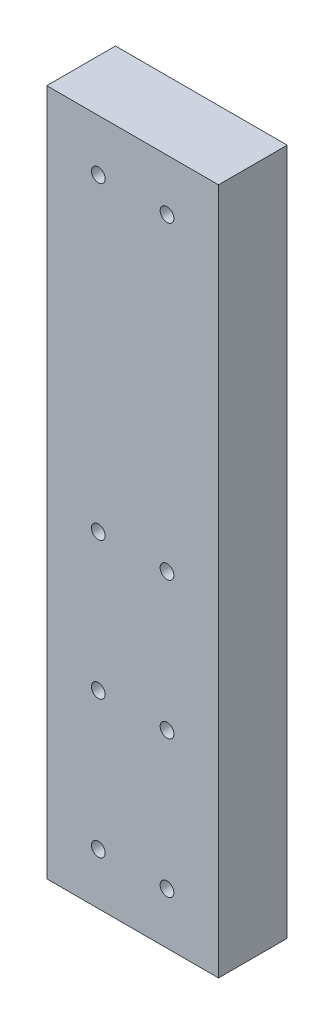
ISO-10303-21;
HEADER;
FILE_DESCRIPTION(('STEP AP214'),'2;1');
FILE_NAME('part.step','',(''),(''),'','','');
FILE_SCHEMA(('AUTOMOTIVE_DESIGN { 1 0 10303 214 1 1 1 1 }'));
ENDSEC;
DATA;
#1=APPLICATION_CONTEXT('core data for automotive mechanical design processes');
#2=APPLICATION_PROTOCOL_DEFINITION('international standard','automotive_design',2000,#1);
#3=PRODUCT_CONTEXT('',#1,'mechanical');
#4=PRODUCT('Part','Part','',(#3));
#5=PRODUCT_RELATED_PRODUCT_CATEGORY('part','',(#4));
#6=PRODUCT_DEFINITION_FORMATION('','',#4);
#7=PRODUCT_DEFINITION_CONTEXT('part definition',#1,'design');
#8=PRODUCT_DEFINITION('design','',#6,#7);
#9=PRODUCT_DEFINITION_SHAPE('','',#8);
#10=(LENGTH_UNIT() NAMED_UNIT(*) SI_UNIT(.MILLI.,.METRE.));
#11=(NAMED_UNIT(*) PLANE_ANGLE_UNIT() SI_UNIT($,.RADIAN.));
#12=(NAMED_UNIT(*) SI_UNIT($,.STERADIAN.) SOLID_ANGLE_UNIT());
#13=UNCERTAINTY_MEASURE_WITH_UNIT(LENGTH_MEASURE(1.E-05),#10,'distance_accuracy_value','');
#14=(GEOMETRIC_REPRESENTATION_CONTEXT(3) GLOBAL_UNCERTAINTY_ASSIGNED_CONTEXT((#13)) GLOBAL_UNIT_ASSIGNED_CONTEXT((#10,
#11,#12)) REPRESENTATION_CONTEXT('',''));
#15=CARTESIAN_POINT('',(0.,0.,0.));
#16=DIRECTION('',(0.,0.,1.));
#17=DIRECTION('',(1.,0.,0.));
#18=AXIS2_PLACEMENT_3D('',#15,#16,#17);
#19=CARTESIAN_POINT('',(0.,0.,10.));
#20=DIRECTION('',(0.,0.,-1.));
#21=DIRECTION('',(-1.,0.,0.));
#22=AXIS2_PLACEMENT_3D('',#19,#20,#21);
#23=PLANE('',#22);
#24=CARTESIAN_POINT('',(7.49999999999999,47.5,10.));
#25=DIRECTION('',(0.,0.,1.));
#26=DIRECTION('',(1.,0.,0.));
#27=AXIS2_PLACEMENT_3D('',#24,#25,#26);
#28=CIRCLE('',#27,1.);
#29=CARTESIAN_POINT('',(8.5,47.5,10.));
#30=VERTEX_POINT('',#29);
#31=EDGE_CURVE('E139',#30,#30,#28,.T.);
#32=ORIENTED_EDGE('',*,*,#31,.F.);
#33=EDGE_LOOP('',(#32));
#34=FACE_BOUND('',#33,.T.);
#35=CARTESIAN_POINT('',(7.5,27.5,10.));
#36=DIRECTION('',(0.,0.,1.));
#37=DIRECTION('',(1.,0.,0.));
#38=AXIS2_PLACEMENT_3D('',#35,#36,#37);
#39=CIRCLE('',#38,1.);
#40=CARTESIAN_POINT('',(8.5,27.5,10.));
#41=VERTEX_POINT('',#40);
#42=EDGE_CURVE('E126',#41,#41,#39,.T.);
#43=ORIENTED_EDGE('',*,*,#42,.F.);
#44=EDGE_LOOP('',(#43));
#45=FACE_BOUND('',#44,.T.);
#46=CARTESIAN_POINT('',(7.5,7.5,10.));
#47=DIRECTION('',(0.,0.,1.));
#48=DIRECTION('',(1.,0.,0.));
#49=AXIS2_PLACEMENT_3D('',#46,#47,#48);
#50=CIRCLE('',#49,1.);
#51=CARTESIAN_POINT('',(8.5,7.5,10.));
#52=VERTEX_POINT('',#51);
#53=EDGE_CURVE('E156',#52,#52,#50,.T.);
#54=ORIENTED_EDGE('',*,*,#53,.F.);
#55=EDGE_LOOP('',(#54));
#56=FACE_BOUND('',#55,.T.);
#57=CARTESIAN_POINT('',(7.49999999999999,92.5,10.));
#58=DIRECTION('',(0.,0.,1.));
#59=DIRECTION('',(1.,0.,0.));
#60=AXIS2_PLACEMENT_3D('',#57,#58,#59);
#61=CIRCLE('',#60,1.);
#62=CARTESIAN_POINT('',(8.49999999999999,92.5,10.));
#63=VERTEX_POINT('',#62);
#64=EDGE_CURVE('E117',#63,#63,#61,.T.);
#65=ORIENTED_EDGE('',*,*,#64,.F.);
#66=EDGE_LOOP('',(#65));
#67=FACE_BOUND('',#66,.T.);
#68=DIRECTION('',(0.,-1.,0.));
#69=VECTOR('',#68,1.);
#70=CARTESIAN_POINT('',(0.,0.,10.));
#71=LINE('',#70,#69);
#72=CARTESIAN_POINT('',(0.,100.,10.));
#73=VERTEX_POINT('',#72);
#74=CARTESIAN_POINT('',(0.,0.,10.));
#75=VERTEX_POINT('',#74);
#76=EDGE_CURVE('E90',#73,#75,#71,.T.);
#77=ORIENTED_EDGE('',*,*,#76,.T.);
#78=DIRECTION('',(1.,0.,0.));
#79=VECTOR('',#78,1.);
#80=CARTESIAN_POINT('',(0.,0.,10.));
#81=LINE('',#80,#79);
#82=CARTESIAN_POINT('',(25.,0.,10.));
#83=VERTEX_POINT('',#82);
#84=EDGE_CURVE('E85',#75,#83,#81,.T.);
#85=ORIENTED_EDGE('',*,*,#84,.T.);
#86=DIRECTION('',(0.,1.,0.));
#87=VECTOR('',#86,1.);
#88=CARTESIAN_POINT('',(25.,0.,10.));
#89=LINE('',#88,#87);
#90=CARTESIAN_POINT('',(25.,100.,10.));
#91=VERTEX_POINT('',#90);
#92=EDGE_CURVE('E88',#83,#91,#89,.T.);
#93=ORIENTED_EDGE('',*,*,#92,.T.);
#94=DIRECTION('',(-1.,0.,0.));
#95=VECTOR('',#94,1.);
#96=CARTESIAN_POINT('',(0.,100.,10.));
#97=LINE('',#96,#95);
#98=EDGE_CURVE('E55',#91,#73,#97,.T.);
#99=ORIENTED_EDGE('',*,*,#98,.T.);
#100=EDGE_LOOP('',(#77,#85,#93,#99));
#101=FACE_BOUND('',#100,.T.);
#102=CARTESIAN_POINT('',(17.5,92.5,10.));
#103=DIRECTION('',(0.,0.,-1.));
#104=DIRECTION('',(-1.,0.,0.));
#105=AXIS2_PLACEMENT_3D('',#102,#103,#104);
#106=CIRCLE('',#105,1.);
#107=CARTESIAN_POINT('',(16.5,92.5,10.));
#108=VERTEX_POINT('',#107);
#109=EDGE_CURVE('E150',#108,#108,#106,.T.);
#110=ORIENTED_EDGE('',*,*,#109,.T.);
#111=EDGE_LOOP('',(#110));
#112=FACE_BOUND('',#111,.T.);
#113=CARTESIAN_POINT('',(17.5,7.5,10.));
#114=DIRECTION('',(0.,0.,1.));
#115=DIRECTION('',(1.,0.,0.));
#116=AXIS2_PLACEMENT_3D('',#113,#114,#115);
#117=CIRCLE('',#116,1.);
#118=CARTESIAN_POINT('',(18.5,7.5,10.));
#119=VERTEX_POINT('',#118);
#120=EDGE_CURVE('E127',#119,#119,#117,.F.);
#121=ORIENTED_EDGE('',*,*,#120,.T.);
#122=EDGE_LOOP('',(#121));
#123=FACE_BOUND('',#122,.T.);
#124=CARTESIAN_POINT('',(17.5,27.5,10.));
#125=DIRECTION('',(0.,0.,1.));
#126=DIRECTION('',(1.,0.,0.));
#127=AXIS2_PLACEMENT_3D('',#124,#125,#126);
#128=CIRCLE('',#127,1.);
#129=CARTESIAN_POINT('',(18.5,27.5,10.));
#130=VERTEX_POINT('',#129);
#131=EDGE_CURVE('E133',#130,#130,#128,.F.);
#132=ORIENTED_EDGE('',*,*,#131,.T.);
#133=EDGE_LOOP('',(#132));
#134=FACE_BOUND('',#133,.T.);
#135=CARTESIAN_POINT('',(17.5,47.5,10.));
#136=DIRECTION('',(0.,0.,1.));
#137=DIRECTION('',(1.,0.,0.));
#138=AXIS2_PLACEMENT_3D('',#135,#136,#137);
#139=CIRCLE('',#138,1.00000000000001);
#140=CARTESIAN_POINT('',(18.5,47.5,10.));
#141=VERTEX_POINT('',#140);
#142=EDGE_CURVE('E120',#141,#141,#139,.F.);
#143=ORIENTED_EDGE('',*,*,#142,.T.);
#144=EDGE_LOOP('',(#143));
#145=FACE_BOUND('',#144,.T.);
#146=ADVANCED_FACE('F38',(#34,#45,#56,#67,#101,#112,#123,#134,#145),#23,.F.);
#147=CARTESIAN_POINT('',(0.,0.,0.));
#148=DIRECTION('',(0.,0.,-1.));
#149=DIRECTION('',(-1.,0.,0.));
#150=AXIS2_PLACEMENT_3D('',#147,#148,#149);
#151=PLANE('',#150);
#152=CARTESIAN_POINT('',(17.5,27.5,0.));
#153=DIRECTION('',(0.,0.,1.));
#154=DIRECTION('',(1.,0.,0.));
#155=AXIS2_PLACEMENT_3D('',#152,#153,#154);
#156=CIRCLE('',#155,1.);
#157=CARTESIAN_POINT('',(18.5,27.5,0.));
#158=VERTEX_POINT('',#157);
#159=EDGE_CURVE('E130',#158,#158,#156,.F.);
#160=ORIENTED_EDGE('',*,*,#159,.F.);
#161=EDGE_LOOP('',(#160));
#162=FACE_BOUND('',#161,.T.);
#163=CARTESIAN_POINT('',(7.5,27.5,0.));
#164=DIRECTION('',(0.,0.,1.));
#165=DIRECTION('',(1.,0.,0.));
#166=AXIS2_PLACEMENT_3D('',#163,#164,#165);
#167=CIRCLE('',#166,1.);
#168=CARTESIAN_POINT('',(8.5,27.5,0.));
#169=VERTEX_POINT('',#168);
#170=EDGE_CURVE('E123',#169,#169,#167,.T.);
#171=ORIENTED_EDGE('',*,*,#170,.T.);
#172=EDGE_LOOP('',(#171));
#173=FACE_BOUND('',#172,.T.);
#174=CARTESIAN_POINT('',(17.5,92.5,0.));
#175=DIRECTION('',(0.,0.,-1.));
#176=DIRECTION('',(-1.,0.,0.));
#177=AXIS2_PLACEMENT_3D('',#174,#175,#176);
#178=CIRCLE('',#177,1.);
#179=CARTESIAN_POINT('',(16.5,92.5,0.));
#180=VERTEX_POINT('',#179);
#181=EDGE_CURVE('E147',#180,#180,#178,.T.);
#182=ORIENTED_EDGE('',*,*,#181,.F.);
#183=EDGE_LOOP('',(#182));
#184=FACE_BOUND('',#183,.T.);
#185=CARTESIAN_POINT('',(7.49999999999999,92.5,0.));
#186=DIRECTION('',(0.,0.,1.));
#187=DIRECTION('',(1.,0.,0.));
#188=AXIS2_PLACEMENT_3D('',#185,#186,#187);
#189=CIRCLE('',#188,1.);
#190=CARTESIAN_POINT('',(8.49999999999999,92.5,0.));
#191=VERTEX_POINT('',#190);
#192=EDGE_CURVE('E105',#191,#191,#189,.T.);
#193=ORIENTED_EDGE('',*,*,#192,.T.);
#194=EDGE_LOOP('',(#193));
#195=FACE_BOUND('',#194,.T.);
#196=DIRECTION('',(0.,-1.,0.));
#197=VECTOR('',#196,1.);
#198=CARTESIAN_POINT('',(0.,0.,0.));
#199=LINE('',#198,#197);
#200=CARTESIAN_POINT('',(0.,100.,0.));
#201=VERTEX_POINT('',#200);
#202=CARTESIAN_POINT('',(0.,0.,0.));
#203=VERTEX_POINT('',#202);
#204=EDGE_CURVE('E102',#201,#203,#199,.T.);
#205=ORIENTED_EDGE('',*,*,#204,.F.);
#206=DIRECTION('',(-1.,0.,0.));
#207=VECTOR('',#206,1.);
#208=CARTESIAN_POINT('',(0.,100.,0.));
#209=LINE('',#208,#207);
#210=CARTESIAN_POINT('',(25.,100.,0.));
#211=VERTEX_POINT('',#210);
#212=EDGE_CURVE('E78',#211,#201,#209,.T.);
#213=ORIENTED_EDGE('',*,*,#212,.F.);
#214=DIRECTION('',(0.,1.,0.));
#215=VECTOR('',#214,1.);
#216=CARTESIAN_POINT('',(25.,0.,0.));
#217=LINE('',#216,#215);
#218=CARTESIAN_POINT('',(25.,0.,0.));
#219=VERTEX_POINT('',#218);
#220=EDGE_CURVE('E72',#219,#211,#217,.T.);
#221=ORIENTED_EDGE('',*,*,#220,.F.);
#222=DIRECTION('',(1.,0.,0.));
#223=VECTOR('',#222,1.);
#224=CARTESIAN_POINT('',(0.,0.,0.));
#225=LINE('',#224,#223);
#226=EDGE_CURVE('E94',#203,#219,#225,.T.);
#227=ORIENTED_EDGE('',*,*,#226,.F.);
#228=EDGE_LOOP('',(#205,#213,#221,#227));
#229=FACE_BOUND('',#228,.T.);
#230=CARTESIAN_POINT('',(7.5,7.5,0.));
#231=DIRECTION('',(0.,0.,1.));
#232=DIRECTION('',(1.,0.,0.));
#233=AXIS2_PLACEMENT_3D('',#230,#231,#232);
#234=CIRCLE('',#233,1.);
#235=CARTESIAN_POINT('',(8.5,7.5,0.));
#236=VERTEX_POINT('',#235);
#237=EDGE_CURVE('E153',#236,#236,#234,.T.);
#238=ORIENTED_EDGE('',*,*,#237,.T.);
#239=EDGE_LOOP('',(#238));
#240=FACE_BOUND('',#239,.T.);
#241=CARTESIAN_POINT('',(17.5,7.5,0.));
#242=DIRECTION('',(0.,0.,1.));
#243=DIRECTION('',(1.,0.,0.));
#244=AXIS2_PLACEMENT_3D('',#241,#242,#243);
#245=CIRCLE('',#244,1.);
#246=CARTESIAN_POINT('',(18.5,7.5,0.));
#247=VERTEX_POINT('',#246);
#248=EDGE_CURVE('E159',#247,#247,#245,.F.);
#249=ORIENTED_EDGE('',*,*,#248,.F.);
#250=EDGE_LOOP('',(#249));
#251=FACE_BOUND('',#250,.T.);
#252=CARTESIAN_POINT('',(7.49999999999999,47.5,0.));
#253=DIRECTION('',(0.,0.,1.));
#254=DIRECTION('',(1.,0.,0.));
#255=AXIS2_PLACEMENT_3D('',#252,#253,#254);
#256=CIRCLE('',#255,1.);
#257=CARTESIAN_POINT('',(8.5,47.5,0.));
#258=VERTEX_POINT('',#257);
#259=EDGE_CURVE('E136',#258,#258,#256,.T.);
#260=ORIENTED_EDGE('',*,*,#259,.T.);
#261=EDGE_LOOP('',(#260));
#262=FACE_BOUND('',#261,.T.);
#263=CARTESIAN_POINT('',(17.5,47.5,0.));
#264=DIRECTION('',(0.,0.,1.));
#265=DIRECTION('',(1.,0.,0.));
#266=AXIS2_PLACEMENT_3D('',#263,#264,#265);
#267=CIRCLE('',#266,1.00000000000001);
#268=CARTESIAN_POINT('',(18.5,47.5,0.));
#269=VERTEX_POINT('',#268);
#270=EDGE_CURVE('E142',#269,#269,#267,.F.);
#271=ORIENTED_EDGE('',*,*,#270,.F.);
#272=EDGE_LOOP('',(#271));
#273=FACE_BOUND('',#272,.T.);
#274=ADVANCED_FACE('F113',(#162,#173,#184,#195,#229,#240,#251,#262,#273),#151,.T.);
#275=CARTESIAN_POINT('',(0.,0.,10.));
#276=DIRECTION('',(1.,0.,0.));
#277=DIRECTION('',(0.,0.,-1.));
#278=AXIS2_PLACEMENT_3D('',#275,#276,#277);
#279=PLANE('',#278);
#280=ORIENTED_EDGE('',*,*,#204,.T.);
#281=DIRECTION('',(0.,0.,-1.));
#282=VECTOR('',#281,1.);
#283=CARTESIAN_POINT('',(0.,0.,10.));
#284=LINE('',#283,#282);
#285=EDGE_CURVE('E11',#75,#203,#284,.T.);
#286=ORIENTED_EDGE('',*,*,#285,.F.);
#287=ORIENTED_EDGE('',*,*,#76,.F.);
#288=DIRECTION('',(0.,0.,-1.));
#289=VECTOR('',#288,1.);
#290=CARTESIAN_POINT('',(0.,100.,10.));
#291=LINE('',#290,#289);
#292=EDGE_CURVE('E98',#73,#201,#291,.T.);
#293=ORIENTED_EDGE('',*,*,#292,.T.);
#294=EDGE_LOOP('',(#280,#286,#287,#293));
#295=FACE_BOUND('',#294,.T.);
#296=ADVANCED_FACE('F40',(#295),#279,.F.);
#297=CARTESIAN_POINT('',(0.,0.,10.));
#298=DIRECTION('',(0.,1.,0.));
#299=DIRECTION('',(0.,0.,1.));
#300=AXIS2_PLACEMENT_3D('',#297,#298,#299);
#301=PLANE('',#300);
#302=ORIENTED_EDGE('',*,*,#226,.T.);
#303=DIRECTION('',(0.,0.,-1.));
#304=VECTOR('',#303,1.);
#305=CARTESIAN_POINT('',(25.,0.,10.));
#306=LINE('',#305,#304);
#307=EDGE_CURVE('E47',#83,#219,#306,.T.);
#308=ORIENTED_EDGE('',*,*,#307,.F.);
#309=ORIENTED_EDGE('',*,*,#84,.F.);
#310=ORIENTED_EDGE('',*,*,#285,.T.);
#311=EDGE_LOOP('',(#302,#308,#309,#310));
#312=FACE_BOUND('',#311,.T.);
#313=ADVANCED_FACE('F93',(#312),#301,.F.);
#314=CARTESIAN_POINT('',(25.,0.,10.));
#315=DIRECTION('',(-1.,0.,0.));
#316=DIRECTION('',(0.,0.,1.));
#317=AXIS2_PLACEMENT_3D('',#314,#315,#316);
#318=PLANE('',#317);
#319=ORIENTED_EDGE('',*,*,#220,.T.);
#320=DIRECTION('',(0.,0.,-1.));
#321=VECTOR('',#320,1.);
#322=CARTESIAN_POINT('',(25.,100.,10.));
#323=LINE('',#322,#321);
#324=EDGE_CURVE('E95',#91,#211,#323,.T.);
#325=ORIENTED_EDGE('',*,*,#324,.F.);
#326=ORIENTED_EDGE('',*,*,#92,.F.);
#327=ORIENTED_EDGE('',*,*,#307,.T.);
#328=EDGE_LOOP('',(#319,#325,#326,#327));
#329=FACE_BOUND('',#328,.T.);
#330=ADVANCED_FACE('F96',(#329),#318,.F.);
#331=CARTESIAN_POINT('',(0.,100.,10.));
#332=DIRECTION('',(0.,-1.,0.));
#333=DIRECTION('',(0.,0.,-1.));
#334=AXIS2_PLACEMENT_3D('',#331,#332,#333);
#335=PLANE('',#334);
#336=ORIENTED_EDGE('',*,*,#212,.T.);
#337=ORIENTED_EDGE('',*,*,#292,.F.);
#338=ORIENTED_EDGE('',*,*,#98,.F.);
#339=ORIENTED_EDGE('',*,*,#324,.T.);
#340=EDGE_LOOP('',(#336,#337,#338,#339));
#341=FACE_BOUND('',#340,.T.);
#342=ADVANCED_FACE('F110',(#341),#335,.F.);
#343=CARTESIAN_POINT('',(7.49999999999999,92.5,0.));
#344=DIRECTION('',(0.,0.,1.));
#345=DIRECTION('',(1.,0.,0.));
#346=AXIS2_PLACEMENT_3D('',#343,#344,#345);
#347=CYLINDRICAL_SURFACE('',#346,1.);
#348=ORIENTED_EDGE('',*,*,#192,.F.);
#349=EDGE_LOOP('',(#348));
#350=FACE_BOUND('',#349,.T.);
#351=ORIENTED_EDGE('',*,*,#64,.T.);
#352=EDGE_LOOP('',(#351));
#353=FACE_BOUND('',#352,.T.);
#354=ADVANCED_FACE('F194',(#350,#353),#347,.F.);
#355=CARTESIAN_POINT('',(17.5,92.5,0.));
#356=DIRECTION('',(0.,0.,1.));
#357=DIRECTION('',(1.,0.,0.));
#358=AXIS2_PLACEMENT_3D('',#355,#356,#357);
#359=CYLINDRICAL_SURFACE('',#358,1.);
#360=ORIENTED_EDGE('',*,*,#181,.T.);
#361=EDGE_LOOP('',(#360));
#362=FACE_BOUND('',#361,.T.);
#363=ORIENTED_EDGE('',*,*,#109,.F.);
#364=EDGE_LOOP('',(#363));
#365=FACE_BOUND('',#364,.T.);
#366=ADVANCED_FACE('F180',(#362,#365),#359,.F.);
#367=CARTESIAN_POINT('',(7.5,7.5,0.));
#368=DIRECTION('',(0.,0.,1.));
#369=DIRECTION('',(1.,0.,0.));
#370=AXIS2_PLACEMENT_3D('',#367,#368,#369);
#371=CYLINDRICAL_SURFACE('',#370,1.);
#372=ORIENTED_EDGE('',*,*,#237,.F.);
#373=EDGE_LOOP('',(#372));
#374=FACE_BOUND('',#373,.T.);
#375=ORIENTED_EDGE('',*,*,#53,.T.);
#376=EDGE_LOOP('',(#375));
#377=FACE_BOUND('',#376,.T.);
#378=ADVANCED_FACE('F170',(#374,#377),#371,.F.);
#379=CARTESIAN_POINT('',(17.5,7.5,0.));
#380=DIRECTION('',(0.,0.,1.));
#381=DIRECTION('',(1.,0.,0.));
#382=AXIS2_PLACEMENT_3D('',#379,#380,#381);
#383=CYLINDRICAL_SURFACE('',#382,1.);
#384=ORIENTED_EDGE('',*,*,#248,.T.);
#385=EDGE_LOOP('',(#384));
#386=FACE_BOUND('',#385,.T.);
#387=ORIENTED_EDGE('',*,*,#120,.F.);
#388=EDGE_LOOP('',(#387));
#389=FACE_BOUND('',#388,.T.);
#390=ADVANCED_FACE('F167',(#386,#389),#383,.F.);
#391=CARTESIAN_POINT('',(7.5,27.5,0.));
#392=DIRECTION('',(0.,0.,1.));
#393=DIRECTION('',(1.,0.,0.));
#394=AXIS2_PLACEMENT_3D('',#391,#392,#393);
#395=CYLINDRICAL_SURFACE('',#394,1.);
#396=ORIENTED_EDGE('',*,*,#170,.F.);
#397=EDGE_LOOP('',(#396));
#398=FACE_BOUND('',#397,.T.);
#399=ORIENTED_EDGE('',*,*,#42,.T.);
#400=EDGE_LOOP('',(#399));
#401=FACE_BOUND('',#400,.T.);
#402=ADVANCED_FACE('F169',(#398,#401),#395,.F.);
#403=CARTESIAN_POINT('',(17.5,27.5,0.));
#404=DIRECTION('',(0.,0.,1.));
#405=DIRECTION('',(1.,0.,0.));
#406=AXIS2_PLACEMENT_3D('',#403,#404,#405);
#407=CYLINDRICAL_SURFACE('',#406,1.);
#408=ORIENTED_EDGE('',*,*,#159,.T.);
#409=EDGE_LOOP('',(#408));
#410=FACE_BOUND('',#409,.T.);
#411=ORIENTED_EDGE('',*,*,#131,.F.);
#412=EDGE_LOOP('',(#411));
#413=FACE_BOUND('',#412,.T.);
#414=ADVANCED_FACE('F177',(#410,#413),#407,.F.);
#415=CARTESIAN_POINT('',(7.49999999999999,47.5,0.));
#416=DIRECTION('',(0.,0.,1.));
#417=DIRECTION('',(1.,0.,0.));
#418=AXIS2_PLACEMENT_3D('',#415,#416,#417);
#419=CYLINDRICAL_SURFACE('',#418,1.);
#420=ORIENTED_EDGE('',*,*,#259,.F.);
#421=EDGE_LOOP('',(#420));
#422=FACE_BOUND('',#421,.T.);
#423=ORIENTED_EDGE('',*,*,#31,.T.);
#424=EDGE_LOOP('',(#423));
#425=FACE_BOUND('',#424,.T.);
#426=ADVANCED_FACE('F255',(#422,#425),#419,.F.);
#427=CARTESIAN_POINT('',(17.5,47.5,0.));
#428=DIRECTION('',(0.,0.,1.));
#429=DIRECTION('',(1.,0.,0.));
#430=AXIS2_PLACEMENT_3D('',#427,#428,#429);
#431=CYLINDRICAL_SURFACE('',#430,1.00000000000001);
#432=ORIENTED_EDGE('',*,*,#270,.T.);
#433=EDGE_LOOP('',(#432));
#434=FACE_BOUND('',#433,.T.);
#435=ORIENTED_EDGE('',*,*,#142,.F.);
#436=EDGE_LOOP('',(#435));
#437=FACE_BOUND('',#436,.T.);
#438=ADVANCED_FACE('F265',(#434,#437),#431,.F.);
#439=CLOSED_SHELL('',(#146,#274,#296,#313,#330,#342,#354,#366,#378,#390,#402,#414,#426,#438));
#440=MANIFOLD_SOLID_BREP('B2',#439);
#441=ADVANCED_BREP_SHAPE_REPRESENTATION('',(#18,#440),#14);
#442=SHAPE_DEFINITION_REPRESENTATION(#9,#441);
ENDSEC;
END-ISO-10303-21;
